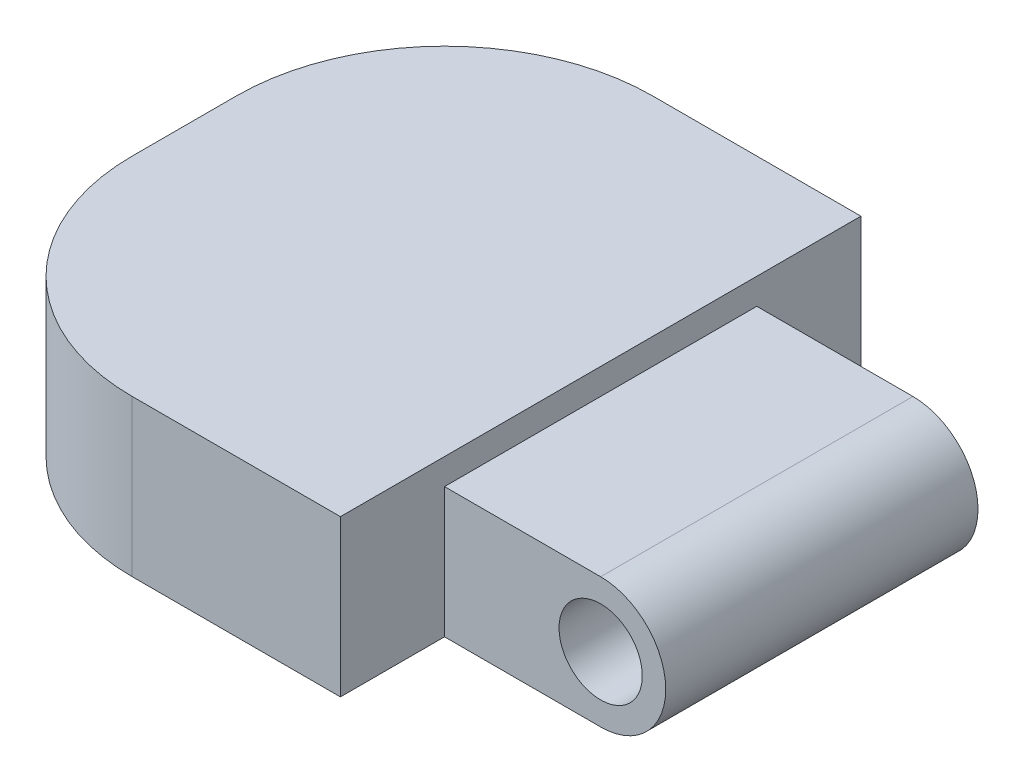
ISO-10303-21;
HEADER;
FILE_DESCRIPTION(('STEP AP214'),'2;1');
FILE_NAME('part.step','',(''),(''),'','','');
FILE_SCHEMA(('AUTOMOTIVE_DESIGN { 1 0 10303 214 1 1 1 1 }'));
ENDSEC;
DATA;
#1=APPLICATION_CONTEXT('core data for automotive mechanical design processes');
#2=APPLICATION_PROTOCOL_DEFINITION('international standard','automotive_design',2000,#1);
#3=PRODUCT_CONTEXT('',#1,'mechanical');
#4=PRODUCT('Part','Part','',(#3));
#5=PRODUCT_RELATED_PRODUCT_CATEGORY('part','',(#4));
#6=PRODUCT_DEFINITION_FORMATION('','',#4);
#7=PRODUCT_DEFINITION_CONTEXT('part definition',#1,'design');
#8=PRODUCT_DEFINITION('design','',#6,#7);
#9=PRODUCT_DEFINITION_SHAPE('','',#8);
#10=(LENGTH_UNIT() NAMED_UNIT(*) SI_UNIT(.MILLI.,.METRE.));
#11=(NAMED_UNIT(*) PLANE_ANGLE_UNIT() SI_UNIT($,.RADIAN.));
#12=(NAMED_UNIT(*) SI_UNIT($,.STERADIAN.) SOLID_ANGLE_UNIT());
#13=UNCERTAINTY_MEASURE_WITH_UNIT(LENGTH_MEASURE(1.E-05),#10,'distance_accuracy_value','');
#14=(GEOMETRIC_REPRESENTATION_CONTEXT(3) GLOBAL_UNCERTAINTY_ASSIGNED_CONTEXT((#13)) GLOBAL_UNIT_ASSIGNED_CONTEXT((#10,
#11,#12)) REPRESENTATION_CONTEXT('',''));
#15=CARTESIAN_POINT('',(0.,0.,0.));
#16=DIRECTION('',(0.,0.,1.));
#17=DIRECTION('',(1.,0.,0.));
#18=AXIS2_PLACEMENT_3D('',#15,#16,#17);
#19=CARTESIAN_POINT('',(50.8,38.1,-63.5));
#20=DIRECTION('',(-1.,0.,0.));
#21=DIRECTION('',(0.,0.,1.));
#22=AXIS2_PLACEMENT_3D('',#19,#20,#21);
#23=PLANE('',#22);
#24=DIRECTION('',(0.,-1.,0.));
#25=VECTOR('',#24,1.);
#26=CARTESIAN_POINT('',(50.8,31.75,38.1));
#27=LINE('',#26,#25);
#28=CARTESIAN_POINT('',(50.8,31.75,38.1));
#29=VERTEX_POINT('',#28);
#30=CARTESIAN_POINT('',(50.8,0.,38.1));
#31=VERTEX_POINT('',#30);
#32=EDGE_CURVE('E192',#29,#31,#27,.T.);
#33=ORIENTED_EDGE('',*,*,#32,.F.);
#34=DIRECTION('',(0.,0.,1.));
#35=VECTOR('',#34,1.);
#36=CARTESIAN_POINT('',(50.8,31.75,-38.1));
#37=LINE('',#36,#35);
#38=CARTESIAN_POINT('',(50.8,31.75,-38.1));
#39=VERTEX_POINT('',#38);
#40=EDGE_CURVE('E172',#39,#29,#37,.T.);
#41=ORIENTED_EDGE('',*,*,#40,.F.);
#42=DIRECTION('',(0.,-1.,0.));
#43=VECTOR('',#42,1.);
#44=CARTESIAN_POINT('',(50.8,31.75,-38.1));
#45=LINE('',#44,#43);
#46=CARTESIAN_POINT('',(50.8,0.,-38.1));
#47=VERTEX_POINT('',#46);
#48=EDGE_CURVE('E181',#39,#47,#45,.T.);
#49=ORIENTED_EDGE('',*,*,#48,.T.);
#50=DIRECTION('',(0.,0.,-1.));
#51=VECTOR('',#50,1.);
#52=CARTESIAN_POINT('',(50.8,0.,-63.5));
#53=LINE('',#52,#51);
#54=CARTESIAN_POINT('',(50.8,0.,-63.5));
#55=VERTEX_POINT('',#54);
#56=EDGE_CURVE('E136',#47,#55,#53,.T.);
#57=ORIENTED_EDGE('',*,*,#56,.T.);
#58=DIRECTION('',(0.,-1.,0.));
#59=VECTOR('',#58,1.);
#60=CARTESIAN_POINT('',(50.8,38.1,-63.5));
#61=LINE('',#60,#59);
#62=CARTESIAN_POINT('',(50.8,38.1,-63.5));
#63=VERTEX_POINT('',#62);
#64=EDGE_CURVE('E11',#63,#55,#61,.T.);
#65=ORIENTED_EDGE('',*,*,#64,.F.);
#66=DIRECTION('',(0.,0.,-1.));
#67=VECTOR('',#66,1.);
#68=CARTESIAN_POINT('',(50.8,38.1,-63.5));
#69=LINE('',#68,#67);
#70=CARTESIAN_POINT('',(50.8,38.1,63.5));
#71=VERTEX_POINT('',#70);
#72=EDGE_CURVE('E144',#71,#63,#69,.T.);
#73=ORIENTED_EDGE('',*,*,#72,.F.);
#74=DIRECTION('',(0.,-1.,0.));
#75=VECTOR('',#74,1.);
#76=CARTESIAN_POINT('',(50.8,38.1,63.5));
#77=LINE('',#76,#75);
#78=CARTESIAN_POINT('',(50.8,0.,63.5));
#79=VERTEX_POINT('',#78);
#80=EDGE_CURVE('E128',#71,#79,#77,.T.);
#81=ORIENTED_EDGE('',*,*,#80,.T.);
#82=EDGE_CURVE('E132',#79,#31,#53,.T.);
#83=ORIENTED_EDGE('',*,*,#82,.T.);
#84=EDGE_LOOP('',(#33,#41,#49,#57,#65,#73,#81,#83));
#85=FACE_BOUND('',#84,.T.);
#86=ADVANCED_FACE('F36',(#85),#23,.F.);
#87=CARTESIAN_POINT('',(50.8,38.1,-63.5));
#88=DIRECTION('',(0.,0.,1.));
#89=DIRECTION('',(1.,0.,0.));
#90=AXIS2_PLACEMENT_3D('',#87,#88,#89);
#91=PLANE('',#90);
#92=DIRECTION('',(-1.,0.,0.));
#93=VECTOR('',#92,1.);
#94=CARTESIAN_POINT('',(50.8,0.,-63.5));
#95=LINE('',#94,#93);
#96=CARTESIAN_POINT('',(0.,0.,-63.5));
#97=VERTEX_POINT('',#96);
#98=EDGE_CURVE('E135',#55,#97,#95,.T.);
#99=ORIENTED_EDGE('',*,*,#98,.T.);
#100=DIRECTION('',(0.,-1.,0.));
#101=VECTOR('',#100,1.);
#102=CARTESIAN_POINT('',(0.,38.1,-63.5));
#103=LINE('',#102,#101);
#104=CARTESIAN_POINT('',(0.,38.1,-63.5));
#105=VERTEX_POINT('',#104);
#106=EDGE_CURVE('E44',#105,#97,#103,.T.);
#107=ORIENTED_EDGE('',*,*,#106,.F.);
#108=DIRECTION('',(-1.,0.,0.));
#109=VECTOR('',#108,1.);
#110=CARTESIAN_POINT('',(50.8,38.1,-63.5));
#111=LINE('',#110,#109);
#112=EDGE_CURVE('E95',#63,#105,#111,.T.);
#113=ORIENTED_EDGE('',*,*,#112,.F.);
#114=ORIENTED_EDGE('',*,*,#64,.T.);
#115=EDGE_LOOP('',(#99,#107,#113,#114));
#116=FACE_BOUND('',#115,.T.);
#117=ADVANCED_FACE('F214',(#116),#91,.F.);
#118=CARTESIAN_POINT('',(0.,38.1,-12.7));
#119=DIRECTION('',(0.,-1.,0.));
#120=DIRECTION('',(0.,0.,-1.));
#121=AXIS2_PLACEMENT_3D('',#118,#119,#120);
#122=CYLINDRICAL_SURFACE('',#121,50.8);
#123=CARTESIAN_POINT('',(0.,0.,-12.7));
#124=DIRECTION('',(0.,1.,0.));
#125=DIRECTION('',(0.,0.,1.));
#126=AXIS2_PLACEMENT_3D('',#123,#124,#125);
#127=CIRCLE('',#126,50.8);
#128=CARTESIAN_POINT('',(-50.8,0.,-12.7));
#129=VERTEX_POINT('',#128);
#130=EDGE_CURVE('E138',#97,#129,#127,.T.);
#131=ORIENTED_EDGE('',*,*,#130,.T.);
#132=DIRECTION('',(0.,-1.,0.));
#133=VECTOR('',#132,1.);
#134=CARTESIAN_POINT('',(-50.8,38.1,-12.7));
#135=LINE('',#134,#133);
#136=CARTESIAN_POINT('',(-50.8,38.1,-12.7));
#137=VERTEX_POINT('',#136);
#138=EDGE_CURVE('E123',#137,#129,#135,.T.);
#139=ORIENTED_EDGE('',*,*,#138,.F.);
#140=CARTESIAN_POINT('',(0.,38.1,-12.7));
#141=DIRECTION('',(0.,1.,0.));
#142=DIRECTION('',(0.,0.,1.));
#143=AXIS2_PLACEMENT_3D('',#140,#141,#142);
#144=CIRCLE('',#143,50.8);
#145=EDGE_CURVE('E111',#105,#137,#144,.T.);
#146=ORIENTED_EDGE('',*,*,#145,.F.);
#147=ORIENTED_EDGE('',*,*,#106,.T.);
#148=EDGE_LOOP('',(#131,#139,#146,#147));
#149=FACE_BOUND('',#148,.T.);
#150=ADVANCED_FACE('F151',(#149),#122,.T.);
#151=CARTESIAN_POINT('',(-50.8,38.1,-12.7));
#152=DIRECTION('',(1.,0.,0.));
#153=DIRECTION('',(0.,0.,-1.));
#154=AXIS2_PLACEMENT_3D('',#151,#152,#153);
#155=PLANE('',#154);
#156=DIRECTION('',(0.,0.,1.));
#157=VECTOR('',#156,1.);
#158=CARTESIAN_POINT('',(-50.8,0.,-12.7));
#159=LINE('',#158,#157);
#160=CARTESIAN_POINT('',(-50.8,0.,12.7));
#161=VERTEX_POINT('',#160);
#162=EDGE_CURVE('E120',#129,#161,#159,.T.);
#163=ORIENTED_EDGE('',*,*,#162,.T.);
#164=DIRECTION('',(0.,-1.,0.));
#165=VECTOR('',#164,1.);
#166=CARTESIAN_POINT('',(-50.8,38.1,12.7));
#167=LINE('',#166,#165);
#168=CARTESIAN_POINT('',(-50.8,38.1,12.7));
#169=VERTEX_POINT('',#168);
#170=EDGE_CURVE('E117',#169,#161,#167,.T.);
#171=ORIENTED_EDGE('',*,*,#170,.F.);
#172=DIRECTION('',(0.,0.,1.));
#173=VECTOR('',#172,1.);
#174=CARTESIAN_POINT('',(-50.8,38.1,-12.7));
#175=LINE('',#174,#173);
#176=EDGE_CURVE('E104',#137,#169,#175,.T.);
#177=ORIENTED_EDGE('',*,*,#176,.F.);
#178=ORIENTED_EDGE('',*,*,#138,.T.);
#179=EDGE_LOOP('',(#163,#171,#177,#178));
#180=FACE_BOUND('',#179,.T.);
#181=ADVANCED_FACE('F118',(#180),#155,.F.);
#182=CARTESIAN_POINT('',(0.,38.1,12.7));
#183=DIRECTION('',(0.,-1.,0.));
#184=DIRECTION('',(0.,0.,-1.));
#185=AXIS2_PLACEMENT_3D('',#182,#183,#184);
#186=CYLINDRICAL_SURFACE('',#185,50.8);
#187=CARTESIAN_POINT('',(0.,0.,12.7));
#188=DIRECTION('',(0.,1.,0.));
#189=DIRECTION('',(0.,0.,-1.));
#190=AXIS2_PLACEMENT_3D('',#187,#188,#189);
#191=CIRCLE('',#190,50.8);
#192=CARTESIAN_POINT('',(0.,0.,63.5));
#193=VERTEX_POINT('',#192);
#194=EDGE_CURVE('E141',#161,#193,#191,.T.);
#195=ORIENTED_EDGE('',*,*,#194,.T.);
#196=DIRECTION('',(0.,-1.,0.));
#197=VECTOR('',#196,1.);
#198=CARTESIAN_POINT('',(0.,38.1,63.5));
#199=LINE('',#198,#197);
#200=CARTESIAN_POINT('',(0.,38.1,63.5));
#201=VERTEX_POINT('',#200);
#202=EDGE_CURVE('E124',#201,#193,#199,.T.);
#203=ORIENTED_EDGE('',*,*,#202,.F.);
#204=CARTESIAN_POINT('',(0.,38.1,12.7));
#205=DIRECTION('',(0.,1.,0.));
#206=DIRECTION('',(0.,0.,-1.));
#207=AXIS2_PLACEMENT_3D('',#204,#205,#206);
#208=CIRCLE('',#207,50.8);
#209=EDGE_CURVE('E108',#169,#201,#208,.T.);
#210=ORIENTED_EDGE('',*,*,#209,.F.);
#211=ORIENTED_EDGE('',*,*,#170,.T.);
#212=EDGE_LOOP('',(#195,#203,#210,#211));
#213=FACE_BOUND('',#212,.T.);
#214=ADVANCED_FACE('F126',(#213),#186,.T.);
#215=CARTESIAN_POINT('',(50.8,38.1,63.5));
#216=DIRECTION('',(0.,0.,-1.));
#217=DIRECTION('',(-1.,0.,0.));
#218=AXIS2_PLACEMENT_3D('',#215,#216,#217);
#219=PLANE('',#218);
#220=DIRECTION('',(1.,0.,0.));
#221=VECTOR('',#220,1.);
#222=CARTESIAN_POINT('',(50.8,0.,63.5));
#223=LINE('',#222,#221);
#224=EDGE_CURVE('E87',#193,#79,#223,.T.);
#225=ORIENTED_EDGE('',*,*,#224,.T.);
#226=ORIENTED_EDGE('',*,*,#80,.F.);
#227=DIRECTION('',(1.,0.,0.));
#228=VECTOR('',#227,1.);
#229=CARTESIAN_POINT('',(50.8,38.1,63.5));
#230=LINE('',#229,#228);
#231=EDGE_CURVE('E60',#201,#71,#230,.T.);
#232=ORIENTED_EDGE('',*,*,#231,.F.);
#233=ORIENTED_EDGE('',*,*,#202,.T.);
#234=EDGE_LOOP('',(#225,#226,#232,#233));
#235=FACE_BOUND('',#234,.T.);
#236=ADVANCED_FACE('F157',(#235),#219,.F.);
#237=CARTESIAN_POINT('',(0.,38.1,12.7));
#238=DIRECTION('',(0.,-1.,0.));
#239=DIRECTION('',(0.,0.,-1.));
#240=AXIS2_PLACEMENT_3D('',#237,#238,#239);
#241=PLANE('',#240);
#242=ORIENTED_EDGE('',*,*,#72,.T.);
#243=ORIENTED_EDGE('',*,*,#112,.T.);
#244=ORIENTED_EDGE('',*,*,#145,.T.);
#245=ORIENTED_EDGE('',*,*,#176,.T.);
#246=ORIENTED_EDGE('',*,*,#209,.T.);
#247=ORIENTED_EDGE('',*,*,#231,.T.);
#248=EDGE_LOOP('',(#242,#243,#244,#245,#246,#247));
#249=FACE_BOUND('',#248,.T.);
#250=ADVANCED_FACE('F106',(#249),#241,.F.);
#251=CARTESIAN_POINT('',(0.,0.,12.7));
#252=DIRECTION('',(0.,-1.,0.));
#253=DIRECTION('',(0.,0.,-1.));
#254=AXIS2_PLACEMENT_3D('',#251,#252,#253);
#255=PLANE('',#254);
#256=ORIENTED_EDGE('',*,*,#82,.F.);
#257=ORIENTED_EDGE('',*,*,#224,.F.);
#258=ORIENTED_EDGE('',*,*,#194,.F.);
#259=ORIENTED_EDGE('',*,*,#162,.F.);
#260=ORIENTED_EDGE('',*,*,#130,.F.);
#261=ORIENTED_EDGE('',*,*,#98,.F.);
#262=ORIENTED_EDGE('',*,*,#56,.F.);
#263=DIRECTION('',(1.,0.,0.));
#264=VECTOR('',#263,1.);
#265=CARTESIAN_POINT('',(50.8,0.,-38.1));
#266=LINE('',#265,#264);
#267=CARTESIAN_POINT('',(88.9,0.,-38.1));
#268=VERTEX_POINT('',#267);
#269=EDGE_CURVE('E51',#47,#268,#266,.T.);
#270=ORIENTED_EDGE('',*,*,#269,.T.);
#271=DIRECTION('',(0.,0.,1.));
#272=VECTOR('',#271,1.);
#273=CARTESIAN_POINT('',(88.9,0.,-38.1));
#274=LINE('',#273,#272);
#275=CARTESIAN_POINT('',(88.9,0.,38.1));
#276=VERTEX_POINT('',#275);
#277=EDGE_CURVE('E165',#268,#276,#274,.T.);
#278=ORIENTED_EDGE('',*,*,#277,.T.);
#279=DIRECTION('',(1.,0.,0.));
#280=VECTOR('',#279,1.);
#281=CARTESIAN_POINT('',(50.8,0.,38.1));
#282=LINE('',#281,#280);
#283=EDGE_CURVE('E189',#31,#276,#282,.T.);
#284=ORIENTED_EDGE('',*,*,#283,.F.);
#285=EDGE_LOOP('',(#256,#257,#258,#259,#260,#261,#262,#270,#278,#284));
#286=FACE_BOUND('',#285,.T.);
#287=ADVANCED_FACE('F155',(#286),#255,.T.);
#288=CARTESIAN_POINT('',(50.8,31.75,-38.1));
#289=DIRECTION('',(0.,1.,0.));
#290=DIRECTION('',(-1.,0.,0.));
#291=AXIS2_PLACEMENT_3D('',#288,#289,#290);
#292=PLANE('',#291);
#293=ORIENTED_EDGE('',*,*,#40,.T.);
#294=DIRECTION('',(-1.,0.,0.));
#295=VECTOR('',#294,1.);
#296=CARTESIAN_POINT('',(50.8,31.75,38.1));
#297=LINE('',#296,#295);
#298=CARTESIAN_POINT('',(88.9,31.75,38.1));
#299=VERTEX_POINT('',#298);
#300=EDGE_CURVE('E183',#299,#29,#297,.T.);
#301=ORIENTED_EDGE('',*,*,#300,.F.);
#302=DIRECTION('',(0.,0.,1.));
#303=VECTOR('',#302,1.);
#304=CARTESIAN_POINT('',(88.9,31.75,-38.1));
#305=LINE('',#304,#303);
#306=CARTESIAN_POINT('',(88.9,31.75,-38.1));
#307=VERTEX_POINT('',#306);
#308=EDGE_CURVE('E168',#307,#299,#305,.T.);
#309=ORIENTED_EDGE('',*,*,#308,.F.);
#310=DIRECTION('',(-1.,0.,0.));
#311=VECTOR('',#310,1.);
#312=CARTESIAN_POINT('',(50.8,31.75,-38.1));
#313=LINE('',#312,#311);
#314=EDGE_CURVE('E169',#307,#39,#313,.T.);
#315=ORIENTED_EDGE('',*,*,#314,.T.);
#316=EDGE_LOOP('',(#293,#301,#309,#315));
#317=FACE_BOUND('',#316,.T.);
#318=ADVANCED_FACE('F231',(#317),#292,.T.);
#319=CARTESIAN_POINT('',(88.9,15.875,-38.1));
#320=DIRECTION('',(0.,0.,1.));
#321=DIRECTION('',(1.,0.,0.));
#322=AXIS2_PLACEMENT_3D('',#319,#320,#321);
#323=CYLINDRICAL_SURFACE('',#322,15.875);
#324=ORIENTED_EDGE('',*,*,#308,.T.);
#325=CARTESIAN_POINT('',(88.9,15.875,38.1));
#326=DIRECTION('',(0.,0.,1.));
#327=DIRECTION('',(-1.,0.,0.));
#328=AXIS2_PLACEMENT_3D('',#325,#326,#327);
#329=CIRCLE('',#328,15.875);
#330=EDGE_CURVE('E186',#276,#299,#329,.T.);
#331=ORIENTED_EDGE('',*,*,#330,.F.);
#332=ORIENTED_EDGE('',*,*,#277,.F.);
#333=CARTESIAN_POINT('',(88.9,15.875,-38.1));
#334=DIRECTION('',(0.,0.,1.));
#335=DIRECTION('',(-1.,0.,0.));
#336=AXIS2_PLACEMENT_3D('',#333,#334,#335);
#337=CIRCLE('',#336,15.875);
#338=EDGE_CURVE('E177',#268,#307,#337,.T.);
#339=ORIENTED_EDGE('',*,*,#338,.T.);
#340=EDGE_LOOP('',(#324,#331,#332,#339));
#341=FACE_BOUND('',#340,.T.);
#342=ADVANCED_FACE('F234',(#341),#323,.T.);
#343=CARTESIAN_POINT('',(88.9,15.875,-38.1));
#344=DIRECTION('',(0.,0.,-1.));
#345=DIRECTION('',(-1.,0.,0.));
#346=AXIS2_PLACEMENT_3D('',#343,#344,#345);
#347=PLANE('',#346);
#348=CARTESIAN_POINT('',(88.9,15.875,-38.1));
#349=DIRECTION('',(0.,0.,-1.));
#350=DIRECTION('',(-1.,0.,0.));
#351=AXIS2_PLACEMENT_3D('',#348,#349,#350);
#352=CIRCLE('',#351,10.16);
#353=CARTESIAN_POINT('',(78.74,15.875,-38.1));
#354=VERTEX_POINT('',#353);
#355=EDGE_CURVE('E195',#354,#354,#352,.T.);
#356=ORIENTED_EDGE('',*,*,#355,.F.);
#357=EDGE_LOOP('',(#356));
#358=FACE_BOUND('',#357,.T.);
#359=ORIENTED_EDGE('',*,*,#48,.F.);
#360=ORIENTED_EDGE('',*,*,#314,.F.);
#361=ORIENTED_EDGE('',*,*,#338,.F.);
#362=ORIENTED_EDGE('',*,*,#269,.F.);
#363=EDGE_LOOP('',(#359,#360,#361,#362));
#364=FACE_BOUND('',#363,.T.);
#365=ADVANCED_FACE('F211',(#358,#364),#347,.T.);
#366=CARTESIAN_POINT('',(88.9,15.875,38.1));
#367=DIRECTION('',(0.,0.,-1.));
#368=DIRECTION('',(-1.,0.,0.));
#369=AXIS2_PLACEMENT_3D('',#366,#367,#368);
#370=PLANE('',#369);
#371=CARTESIAN_POINT('',(88.9,15.875,38.1));
#372=DIRECTION('',(0.,0.,-1.));
#373=DIRECTION('',(-1.,0.,0.));
#374=AXIS2_PLACEMENT_3D('',#371,#372,#373);
#375=CIRCLE('',#374,10.16);
#376=CARTESIAN_POINT('',(78.74,15.875,38.1));
#377=VERTEX_POINT('',#376);
#378=EDGE_CURVE('E39',#377,#377,#375,.T.);
#379=ORIENTED_EDGE('',*,*,#378,.T.);
#380=EDGE_LOOP('',(#379));
#381=FACE_BOUND('',#380,.T.);
#382=ORIENTED_EDGE('',*,*,#32,.T.);
#383=ORIENTED_EDGE('',*,*,#283,.T.);
#384=ORIENTED_EDGE('',*,*,#330,.T.);
#385=ORIENTED_EDGE('',*,*,#300,.T.);
#386=EDGE_LOOP('',(#382,#383,#384,#385));
#387=FACE_BOUND('',#386,.T.);
#388=ADVANCED_FACE('F202',(#381,#387),#370,.F.);
#389=CARTESIAN_POINT('',(88.9,15.875,63.5));
#390=DIRECTION('',(0.,0.,-1.));
#391=DIRECTION('',(-1.,0.,0.));
#392=AXIS2_PLACEMENT_3D('',#389,#390,#391);
#393=CYLINDRICAL_SURFACE('',#392,10.16);
#394=ORIENTED_EDGE('',*,*,#355,.T.);
#395=EDGE_LOOP('',(#394));
#396=FACE_BOUND('',#395,.T.);
#397=ORIENTED_EDGE('',*,*,#378,.F.);
#398=EDGE_LOOP('',(#397));
#399=FACE_BOUND('',#398,.T.);
#400=ADVANCED_FACE('F205',(#396,#399),#393,.F.);
#401=CLOSED_SHELL('',(#86,#117,#150,#181,#214,#236,#250,#287,#318,#342,#365,#388,#400));
#402=MANIFOLD_SOLID_BREP('B2',#401);
#403=ADVANCED_BREP_SHAPE_REPRESENTATION('',(#18,#402),#14);
#404=SHAPE_DEFINITION_REPRESENTATION(#9,#403);
ENDSEC;
END-ISO-10303-21;
